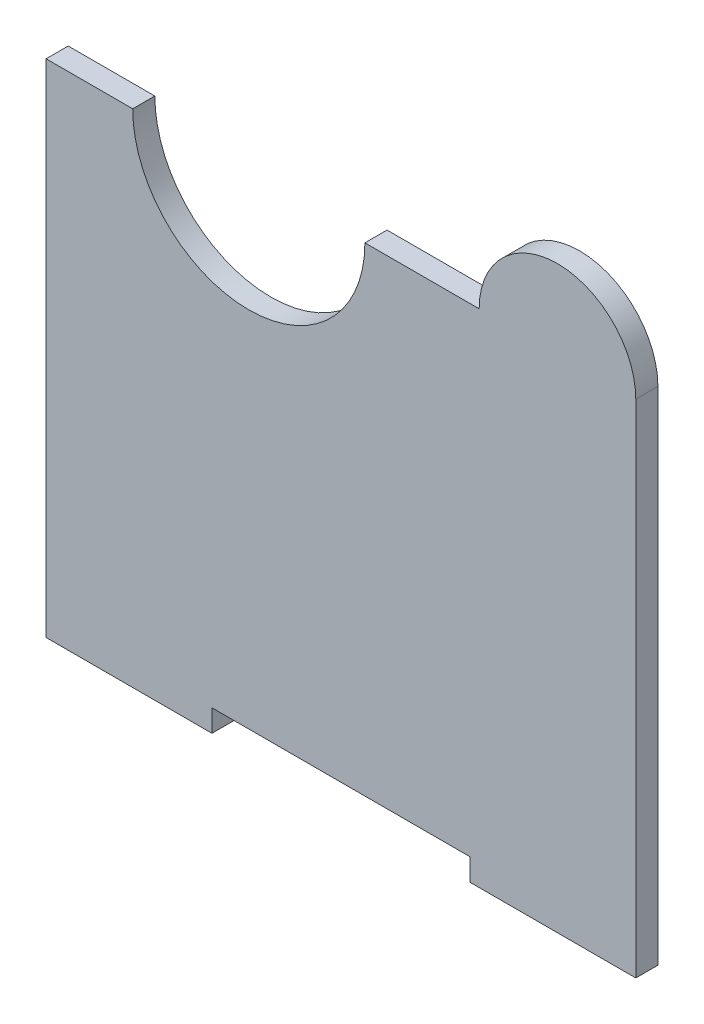
ISO-10303-21;
HEADER;
FILE_DESCRIPTION(('STEP AP214'),'2;1');
FILE_NAME('part.step','',(''),(''),'','','');
FILE_SCHEMA(('AUTOMOTIVE_DESIGN { 1 0 10303 214 1 1 1 1 }'));
ENDSEC;
DATA;
#1=APPLICATION_CONTEXT('core data for automotive mechanical design processes');
#2=APPLICATION_PROTOCOL_DEFINITION('international standard','automotive_design',2000,#1);
#3=PRODUCT_CONTEXT('',#1,'mechanical');
#4=PRODUCT('Part','Part','',(#3));
#5=PRODUCT_RELATED_PRODUCT_CATEGORY('part','',(#4));
#6=PRODUCT_DEFINITION_FORMATION('','',#4);
#7=PRODUCT_DEFINITION_CONTEXT('part definition',#1,'design');
#8=PRODUCT_DEFINITION('design','',#6,#7);
#9=PRODUCT_DEFINITION_SHAPE('','',#8);
#10=(LENGTH_UNIT() NAMED_UNIT(*) SI_UNIT(.MILLI.,.METRE.));
#11=(NAMED_UNIT(*) PLANE_ANGLE_UNIT() SI_UNIT($,.RADIAN.));
#12=(NAMED_UNIT(*) SI_UNIT($,.STERADIAN.) SOLID_ANGLE_UNIT());
#13=UNCERTAINTY_MEASURE_WITH_UNIT(LENGTH_MEASURE(1.E-05),#10,'distance_accuracy_value','');
#14=(GEOMETRIC_REPRESENTATION_CONTEXT(3) GLOBAL_UNCERTAINTY_ASSIGNED_CONTEXT((#13)) GLOBAL_UNIT_ASSIGNED_CONTEXT((#10,
#11,#12)) REPRESENTATION_CONTEXT('',''));
#15=CARTESIAN_POINT('',(0.,0.,0.));
#16=DIRECTION('',(0.,0.,1.));
#17=DIRECTION('',(1.,0.,0.));
#18=AXIS2_PLACEMENT_3D('',#15,#16,#17);
#19=CARTESIAN_POINT('',(83.75,0.,6.));
#20=DIRECTION('',(0.,0.,-1.));
#21=DIRECTION('',(-1.,0.,0.));
#22=AXIS2_PLACEMENT_3D('',#19,#20,#21);
#23=CYLINDRICAL_SURFACE('',#22,21.25);
#24=CARTESIAN_POINT('',(83.75,0.,0.));
#25=DIRECTION('',(0.,0.,1.));
#26=DIRECTION('',(1.,0.,0.));
#27=AXIS2_PLACEMENT_3D('',#24,#25,#26);
#28=CIRCLE('',#27,21.25);
#29=CARTESIAN_POINT('',(105.,0.,0.));
#30=VERTEX_POINT('',#29);
#31=CARTESIAN_POINT('',(62.5,0.,0.));
#32=VERTEX_POINT('',#31);
#33=EDGE_CURVE('E158',#30,#32,#28,.T.);
#34=ORIENTED_EDGE('',*,*,#33,.T.);
#35=DIRECTION('',(0.,0.,-1.));
#36=VECTOR('',#35,1.);
#37=CARTESIAN_POINT('',(62.5,0.,6.));
#38=LINE('',#37,#36);
#39=CARTESIAN_POINT('',(62.5,0.,6.));
#40=VERTEX_POINT('',#39);
#41=EDGE_CURVE('E11',#40,#32,#38,.T.);
#42=ORIENTED_EDGE('',*,*,#41,.F.);
#43=CARTESIAN_POINT('',(83.75,0.,6.));
#44=DIRECTION('',(0.,0.,1.));
#45=DIRECTION('',(1.,0.,0.));
#46=AXIS2_PLACEMENT_3D('',#43,#44,#45);
#47=CIRCLE('',#46,21.25);
#48=CARTESIAN_POINT('',(105.,0.,6.));
#49=VERTEX_POINT('',#48);
#50=EDGE_CURVE('E189',#49,#40,#47,.T.);
#51=ORIENTED_EDGE('',*,*,#50,.F.);
#52=DIRECTION('',(0.,0.,-1.));
#53=VECTOR('',#52,1.);
#54=CARTESIAN_POINT('',(105.,0.,6.));
#55=LINE('',#54,#53);
#56=EDGE_CURVE('E154',#49,#30,#55,.T.);
#57=ORIENTED_EDGE('',*,*,#56,.T.);
#58=EDGE_LOOP('',(#34,#42,#51,#57));
#59=FACE_BOUND('',#58,.T.);
#60=ADVANCED_FACE('F39',(#59),#23,.T.);
#61=CARTESIAN_POINT('',(31.5,0.,6.));
#62=DIRECTION('',(0.,-1.,0.));
#63=DIRECTION('',(1.,0.,0.));
#64=AXIS2_PLACEMENT_3D('',#61,#62,#63);
#65=PLANE('',#64);
#66=DIRECTION('',(-1.,0.,0.));
#67=VECTOR('',#66,1.);
#68=CARTESIAN_POINT('',(31.5,0.,0.));
#69=LINE('',#68,#67);
#70=CARTESIAN_POINT('',(31.5,0.,0.));
#71=VERTEX_POINT('',#70);
#72=EDGE_CURVE('E162',#32,#71,#69,.T.);
#73=ORIENTED_EDGE('',*,*,#72,.T.);
#74=DIRECTION('',(0.,0.,-1.));
#75=VECTOR('',#74,1.);
#76=CARTESIAN_POINT('',(31.5,0.,6.));
#77=LINE('',#76,#75);
#78=CARTESIAN_POINT('',(31.5,0.,6.));
#79=VERTEX_POINT('',#78);
#80=EDGE_CURVE('E48',#79,#71,#77,.T.);
#81=ORIENTED_EDGE('',*,*,#80,.F.);
#82=DIRECTION('',(-1.,0.,0.));
#83=VECTOR('',#82,1.);
#84=CARTESIAN_POINT('',(31.5,0.,6.));
#85=LINE('',#84,#83);
#86=EDGE_CURVE('E108',#40,#79,#85,.T.);
#87=ORIENTED_EDGE('',*,*,#86,.F.);
#88=ORIENTED_EDGE('',*,*,#41,.T.);
#89=EDGE_LOOP('',(#73,#81,#87,#88));
#90=FACE_BOUND('',#89,.T.);
#91=ADVANCED_FACE('F275',(#90),#65,.F.);
#92=CARTESIAN_POINT('',(0.,0.,6.));
#93=DIRECTION('',(0.,0.,-1.));
#94=DIRECTION('',(-1.,0.,0.));
#95=AXIS2_PLACEMENT_3D('',#92,#93,#94);
#96=CYLINDRICAL_SURFACE('',#95,31.5);
#97=CARTESIAN_POINT('',(0.,0.,0.));
#98=DIRECTION('',(0.,0.,-1.));
#99=DIRECTION('',(1.,0.,0.));
#100=AXIS2_PLACEMENT_3D('',#97,#98,#99);
#101=CIRCLE('',#100,31.5);
#102=CARTESIAN_POINT('',(-31.5,0.,0.));
#103=VERTEX_POINT('',#102);
#104=EDGE_CURVE('E165',#71,#103,#101,.T.);
#105=ORIENTED_EDGE('',*,*,#104,.T.);
#106=DIRECTION('',(0.,0.,-1.));
#107=VECTOR('',#106,1.);
#108=CARTESIAN_POINT('',(-31.5,0.,6.));
#109=LINE('',#108,#107);
#110=CARTESIAN_POINT('',(-31.5,0.,6.));
#111=VERTEX_POINT('',#110);
#112=EDGE_CURVE('E212',#111,#103,#109,.T.);
#113=ORIENTED_EDGE('',*,*,#112,.F.);
#114=CARTESIAN_POINT('',(0.,0.,6.));
#115=DIRECTION('',(0.,0.,-1.));
#116=DIRECTION('',(1.,0.,0.));
#117=AXIS2_PLACEMENT_3D('',#114,#115,#116);
#118=CIRCLE('',#117,31.5);
#119=EDGE_CURVE('E222',#79,#111,#118,.T.);
#120=ORIENTED_EDGE('',*,*,#119,.F.);
#121=ORIENTED_EDGE('',*,*,#80,.T.);
#122=EDGE_LOOP('',(#105,#113,#120,#121));
#123=FACE_BOUND('',#122,.T.);
#124=ADVANCED_FACE('F220',(#123),#96,.F.);
#125=CARTESIAN_POINT('',(-55.,0.,6.));
#126=DIRECTION('',(0.,-1.,0.));
#127=DIRECTION('',(1.,0.,0.));
#128=AXIS2_PLACEMENT_3D('',#125,#126,#127);
#129=PLANE('',#128);
#130=DIRECTION('',(-1.,0.,0.));
#131=VECTOR('',#130,1.);
#132=CARTESIAN_POINT('',(-55.,0.,0.));
#133=LINE('',#132,#131);
#134=CARTESIAN_POINT('',(-55.,0.,0.));
#135=VERTEX_POINT('',#134);
#136=EDGE_CURVE('E168',#103,#135,#133,.T.);
#137=ORIENTED_EDGE('',*,*,#136,.T.);
#138=DIRECTION('',(0.,0.,-1.));
#139=VECTOR('',#138,1.);
#140=CARTESIAN_POINT('',(-55.,0.,6.));
#141=LINE('',#140,#139);
#142=CARTESIAN_POINT('',(-55.,0.,6.));
#143=VERTEX_POINT('',#142);
#144=EDGE_CURVE('E208',#143,#135,#141,.T.);
#145=ORIENTED_EDGE('',*,*,#144,.F.);
#146=DIRECTION('',(-1.,0.,0.));
#147=VECTOR('',#146,1.);
#148=CARTESIAN_POINT('',(-55.,0.,6.));
#149=LINE('',#148,#147);
#150=EDGE_CURVE('E241',#111,#143,#149,.T.);
#151=ORIENTED_EDGE('',*,*,#150,.F.);
#152=ORIENTED_EDGE('',*,*,#112,.T.);
#153=EDGE_LOOP('',(#137,#145,#151,#152));
#154=FACE_BOUND('',#153,.T.);
#155=ADVANCED_FACE('F231',(#154),#129,.F.);
#156=CARTESIAN_POINT('',(-55.,0.,6.));
#157=DIRECTION('',(1.,0.,0.));
#158=DIRECTION('',(0.,1.,0.));
#159=AXIS2_PLACEMENT_3D('',#156,#157,#158);
#160=PLANE('',#159);
#161=DIRECTION('',(0.,-1.,0.));
#162=VECTOR('',#161,1.);
#163=CARTESIAN_POINT('',(-55.,0.,0.));
#164=LINE('',#163,#162);
#165=CARTESIAN_POINT('',(-55.,-136.,0.));
#166=VERTEX_POINT('',#165);
#167=EDGE_CURVE('E171',#135,#166,#164,.T.);
#168=ORIENTED_EDGE('',*,*,#167,.T.);
#169=DIRECTION('',(0.,0.,-1.));
#170=VECTOR('',#169,1.);
#171=CARTESIAN_POINT('',(-55.,-136.,6.));
#172=LINE('',#171,#170);
#173=CARTESIAN_POINT('',(-55.,-136.,6.));
#174=VERTEX_POINT('',#173);
#175=EDGE_CURVE('E204',#174,#166,#172,.T.);
#176=ORIENTED_EDGE('',*,*,#175,.F.);
#177=DIRECTION('',(0.,-1.,0.));
#178=VECTOR('',#177,1.);
#179=CARTESIAN_POINT('',(-55.,0.,6.));
#180=LINE('',#179,#178);
#181=EDGE_CURVE('E237',#143,#174,#180,.T.);
#182=ORIENTED_EDGE('',*,*,#181,.F.);
#183=ORIENTED_EDGE('',*,*,#144,.T.);
#184=EDGE_LOOP('',(#168,#176,#182,#183));
#185=FACE_BOUND('',#184,.T.);
#186=ADVANCED_FACE('F235',(#185),#160,.F.);
#187=CARTESIAN_POINT('',(-55.,-136.,6.));
#188=DIRECTION('',(0.,1.,0.));
#189=DIRECTION('',(0.,0.,1.));
#190=AXIS2_PLACEMENT_3D('',#187,#188,#189);
#191=PLANE('',#190);
#192=DIRECTION('',(1.,0.,0.));
#193=VECTOR('',#192,1.);
#194=CARTESIAN_POINT('',(-55.,-136.,0.));
#195=LINE('',#194,#193);
#196=CARTESIAN_POINT('',(-9.99999999999999,-136.,0.));
#197=VERTEX_POINT('',#196);
#198=EDGE_CURVE('E174',#166,#197,#195,.T.);
#199=ORIENTED_EDGE('',*,*,#198,.T.);
#200=DIRECTION('',(0.,0.,-1.));
#201=VECTOR('',#200,1.);
#202=CARTESIAN_POINT('',(-9.99999999999999,-136.,6.));
#203=LINE('',#202,#201);
#204=CARTESIAN_POINT('',(-9.99999999999999,-136.,6.));
#205=VERTEX_POINT('',#204);
#206=EDGE_CURVE('E200',#205,#197,#203,.T.);
#207=ORIENTED_EDGE('',*,*,#206,.F.);
#208=DIRECTION('',(1.,0.,0.));
#209=VECTOR('',#208,1.);
#210=CARTESIAN_POINT('',(-55.,-136.,6.));
#211=LINE('',#210,#209);
#212=EDGE_CURVE('E240',#174,#205,#211,.T.);
#213=ORIENTED_EDGE('',*,*,#212,.F.);
#214=ORIENTED_EDGE('',*,*,#175,.T.);
#215=EDGE_LOOP('',(#199,#207,#213,#214));
#216=FACE_BOUND('',#215,.T.);
#217=ADVANCED_FACE('F288',(#216),#191,.F.);
#218=CARTESIAN_POINT('',(-9.99999999999999,-130.,6.));
#219=DIRECTION('',(-1.,0.,0.));
#220=DIRECTION('',(0.,0.,1.));
#221=AXIS2_PLACEMENT_3D('',#218,#219,#220);
#222=PLANE('',#221);
#223=DIRECTION('',(0.,1.,0.));
#224=VECTOR('',#223,1.);
#225=CARTESIAN_POINT('',(-9.99999999999999,-130.,0.));
#226=LINE('',#225,#224);
#227=CARTESIAN_POINT('',(-9.99999999999999,-130.,0.));
#228=VERTEX_POINT('',#227);
#229=EDGE_CURVE('E177',#197,#228,#226,.T.);
#230=ORIENTED_EDGE('',*,*,#229,.T.);
#231=DIRECTION('',(0.,0.,-1.));
#232=VECTOR('',#231,1.);
#233=CARTESIAN_POINT('',(-9.99999999999999,-130.,6.));
#234=LINE('',#233,#232);
#235=CARTESIAN_POINT('',(-9.99999999999999,-130.,6.));
#236=VERTEX_POINT('',#235);
#237=EDGE_CURVE('E196',#236,#228,#234,.T.);
#238=ORIENTED_EDGE('',*,*,#237,.F.);
#239=DIRECTION('',(0.,1.,0.));
#240=VECTOR('',#239,1.);
#241=CARTESIAN_POINT('',(-9.99999999999999,-130.,6.));
#242=LINE('',#241,#240);
#243=EDGE_CURVE('E245',#205,#236,#242,.T.);
#244=ORIENTED_EDGE('',*,*,#243,.F.);
#245=ORIENTED_EDGE('',*,*,#206,.T.);
#246=EDGE_LOOP('',(#230,#238,#244,#245));
#247=FACE_BOUND('',#246,.T.);
#248=ADVANCED_FACE('F256',(#247),#222,.F.);
#249=CARTESIAN_POINT('',(60.,-130.,6.));
#250=DIRECTION('',(0.,1.,0.));
#251=DIRECTION('',(0.,0.,1.));
#252=AXIS2_PLACEMENT_3D('',#249,#250,#251);
#253=PLANE('',#252);
#254=DIRECTION('',(1.,0.,0.));
#255=VECTOR('',#254,1.);
#256=CARTESIAN_POINT('',(60.,-130.,0.));
#257=LINE('',#256,#255);
#258=CARTESIAN_POINT('',(60.,-130.,0.));
#259=VERTEX_POINT('',#258);
#260=EDGE_CURVE('E180',#228,#259,#257,.T.);
#261=ORIENTED_EDGE('',*,*,#260,.T.);
#262=DIRECTION('',(0.,0.,-1.));
#263=VECTOR('',#262,1.);
#264=CARTESIAN_POINT('',(60.,-130.,6.));
#265=LINE('',#264,#263);
#266=CARTESIAN_POINT('',(60.,-130.,6.));
#267=VERTEX_POINT('',#266);
#268=EDGE_CURVE('E147',#267,#259,#265,.T.);
#269=ORIENTED_EDGE('',*,*,#268,.F.);
#270=DIRECTION('',(1.,0.,0.));
#271=VECTOR('',#270,1.);
#272=CARTESIAN_POINT('',(60.,-130.,6.));
#273=LINE('',#272,#271);
#274=EDGE_CURVE('E136',#236,#267,#273,.T.);
#275=ORIENTED_EDGE('',*,*,#274,.F.);
#276=ORIENTED_EDGE('',*,*,#237,.T.);
#277=EDGE_LOOP('',(#261,#269,#275,#276));
#278=FACE_BOUND('',#277,.T.);
#279=ADVANCED_FACE('F260',(#278),#253,.F.);
#280=CARTESIAN_POINT('',(60.,-130.,6.));
#281=DIRECTION('',(1.,0.,0.));
#282=DIRECTION('',(0.,0.,-1.));
#283=AXIS2_PLACEMENT_3D('',#280,#281,#282);
#284=PLANE('',#283);
#285=DIRECTION('',(0.,-1.,0.));
#286=VECTOR('',#285,1.);
#287=CARTESIAN_POINT('',(60.,-130.,0.));
#288=LINE('',#287,#286);
#289=CARTESIAN_POINT('',(60.,-136.,0.));
#290=VERTEX_POINT('',#289);
#291=EDGE_CURVE('E145',#259,#290,#288,.T.);
#292=ORIENTED_EDGE('',*,*,#291,.T.);
#293=DIRECTION('',(0.,0.,-1.));
#294=VECTOR('',#293,1.);
#295=CARTESIAN_POINT('',(60.,-136.,6.));
#296=LINE('',#295,#294);
#297=CARTESIAN_POINT('',(60.,-136.,6.));
#298=VERTEX_POINT('',#297);
#299=EDGE_CURVE('E142',#298,#290,#296,.T.);
#300=ORIENTED_EDGE('',*,*,#299,.F.);
#301=DIRECTION('',(0.,-1.,0.));
#302=VECTOR('',#301,1.);
#303=CARTESIAN_POINT('',(60.,-130.,6.));
#304=LINE('',#303,#302);
#305=EDGE_CURVE('E130',#267,#298,#304,.T.);
#306=ORIENTED_EDGE('',*,*,#305,.F.);
#307=ORIENTED_EDGE('',*,*,#268,.T.);
#308=EDGE_LOOP('',(#292,#300,#306,#307));
#309=FACE_BOUND('',#308,.T.);
#310=ADVANCED_FACE('F143',(#309),#284,.F.);
#311=CARTESIAN_POINT('',(105.,-136.,6.));
#312=DIRECTION('',(0.,1.,0.));
#313=DIRECTION('',(0.,0.,1.));
#314=AXIS2_PLACEMENT_3D('',#311,#312,#313);
#315=PLANE('',#314);
#316=DIRECTION('',(1.,0.,0.));
#317=VECTOR('',#316,1.);
#318=CARTESIAN_POINT('',(105.,-136.,0.));
#319=LINE('',#318,#317);
#320=CARTESIAN_POINT('',(105.,-136.,0.));
#321=VERTEX_POINT('',#320);
#322=EDGE_CURVE('E94',#290,#321,#319,.T.);
#323=ORIENTED_EDGE('',*,*,#322,.T.);
#324=DIRECTION('',(0.,0.,-1.));
#325=VECTOR('',#324,1.);
#326=CARTESIAN_POINT('',(105.,-136.,6.));
#327=LINE('',#326,#325);
#328=CARTESIAN_POINT('',(105.,-136.,6.));
#329=VERTEX_POINT('',#328);
#330=EDGE_CURVE('E148',#329,#321,#327,.T.);
#331=ORIENTED_EDGE('',*,*,#330,.F.);
#332=DIRECTION('',(1.,0.,0.));
#333=VECTOR('',#332,1.);
#334=CARTESIAN_POINT('',(105.,-136.,6.));
#335=LINE('',#334,#333);
#336=EDGE_CURVE('E134',#298,#329,#335,.T.);
#337=ORIENTED_EDGE('',*,*,#336,.F.);
#338=ORIENTED_EDGE('',*,*,#299,.T.);
#339=EDGE_LOOP('',(#323,#331,#337,#338));
#340=FACE_BOUND('',#339,.T.);
#341=ADVANCED_FACE('F150',(#340),#315,.F.);
#342=CARTESIAN_POINT('',(105.,0.,6.));
#343=DIRECTION('',(-1.,0.,0.));
#344=DIRECTION('',(0.,-1.,0.));
#345=AXIS2_PLACEMENT_3D('',#342,#343,#344);
#346=PLANE('',#345);
#347=DIRECTION('',(0.,1.,0.));
#348=VECTOR('',#347,1.);
#349=CARTESIAN_POINT('',(105.,0.,0.));
#350=LINE('',#349,#348);
#351=EDGE_CURVE('E100',#321,#30,#350,.T.);
#352=ORIENTED_EDGE('',*,*,#351,.T.);
#353=ORIENTED_EDGE('',*,*,#56,.F.);
#354=DIRECTION('',(0.,1.,0.));
#355=VECTOR('',#354,1.);
#356=CARTESIAN_POINT('',(105.,0.,6.));
#357=LINE('',#356,#355);
#358=EDGE_CURVE('E56',#329,#49,#357,.T.);
#359=ORIENTED_EDGE('',*,*,#358,.F.);
#360=ORIENTED_EDGE('',*,*,#330,.T.);
#361=EDGE_LOOP('',(#352,#353,#359,#360));
#362=FACE_BOUND('',#361,.T.);
#363=ADVANCED_FACE('F264',(#362),#346,.F.);
#364=CARTESIAN_POINT('',(83.75,0.,6.));
#365=DIRECTION('',(0.,0.,1.));
#366=DIRECTION('',(1.,0.,0.));
#367=AXIS2_PLACEMENT_3D('',#364,#365,#366);
#368=PLANE('',#367);
#369=ORIENTED_EDGE('',*,*,#50,.T.);
#370=ORIENTED_EDGE('',*,*,#86,.T.);
#371=ORIENTED_EDGE('',*,*,#119,.T.);
#372=ORIENTED_EDGE('',*,*,#150,.T.);
#373=ORIENTED_EDGE('',*,*,#181,.T.);
#374=ORIENTED_EDGE('',*,*,#212,.T.);
#375=ORIENTED_EDGE('',*,*,#243,.T.);
#376=ORIENTED_EDGE('',*,*,#274,.T.);
#377=ORIENTED_EDGE('',*,*,#305,.T.);
#378=ORIENTED_EDGE('',*,*,#336,.T.);
#379=ORIENTED_EDGE('',*,*,#358,.T.);
#380=EDGE_LOOP('',(#369,#370,#371,#372,#373,#374,#375,#376,#377,#378,#379));
#381=FACE_BOUND('',#380,.T.);
#382=ADVANCED_FACE('F132',(#381),#368,.T.);
#383=CARTESIAN_POINT('',(83.75,0.,0.));
#384=DIRECTION('',(0.,0.,1.));
#385=DIRECTION('',(1.,0.,0.));
#386=AXIS2_PLACEMENT_3D('',#383,#384,#385);
#387=PLANE('',#386);
#388=ORIENTED_EDGE('',*,*,#33,.F.);
#389=ORIENTED_EDGE('',*,*,#351,.F.);
#390=ORIENTED_EDGE('',*,*,#322,.F.);
#391=ORIENTED_EDGE('',*,*,#291,.F.);
#392=ORIENTED_EDGE('',*,*,#260,.F.);
#393=ORIENTED_EDGE('',*,*,#229,.F.);
#394=ORIENTED_EDGE('',*,*,#198,.F.);
#395=ORIENTED_EDGE('',*,*,#167,.F.);
#396=ORIENTED_EDGE('',*,*,#136,.F.);
#397=ORIENTED_EDGE('',*,*,#104,.F.);
#398=ORIENTED_EDGE('',*,*,#72,.F.);
#399=EDGE_LOOP('',(#388,#389,#390,#391,#392,#393,#394,#395,#396,#397,#398));
#400=FACE_BOUND('',#399,.T.);
#401=ADVANCED_FACE('F226',(#400),#387,.F.);
#402=CLOSED_SHELL('',(#60,#91,#124,#155,#186,#217,#248,#279,#310,#341,#363,#382,#401));
#403=MANIFOLD_SOLID_BREP('B2',#402);
#404=ADVANCED_BREP_SHAPE_REPRESENTATION('',(#18,#403),#14);
#405=SHAPE_DEFINITION_REPRESENTATION(#9,#404);
ENDSEC;
END-ISO-10303-21;
